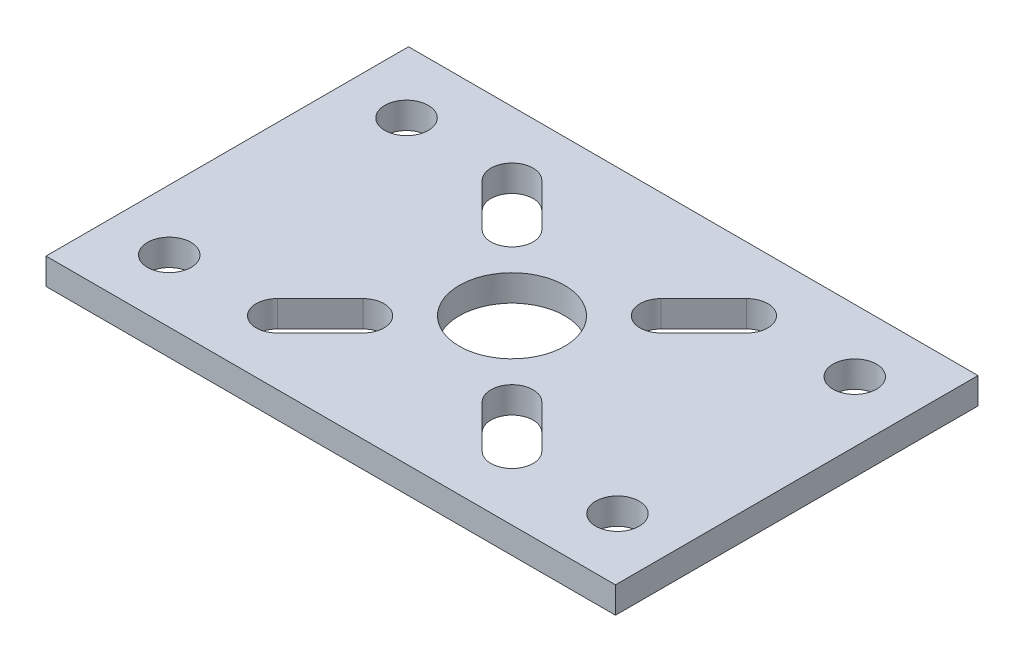
ISO-10303-21;
HEADER;
FILE_DESCRIPTION(('STEP AP214'),'2;1');
FILE_NAME('part.step','',(''),(''),'','','');
FILE_SCHEMA(('AUTOMOTIVE_DESIGN { 1 0 10303 214 1 1 1 1 }'));
ENDSEC;
DATA;
#1=APPLICATION_CONTEXT('core data for automotive mechanical design processes');
#2=APPLICATION_PROTOCOL_DEFINITION('international standard','automotive_design',2000,#1);
#3=PRODUCT_CONTEXT('',#1,'mechanical');
#4=PRODUCT('Part','Part','',(#3));
#5=PRODUCT_RELATED_PRODUCT_CATEGORY('part','',(#4));
#6=PRODUCT_DEFINITION_FORMATION('','',#4);
#7=PRODUCT_DEFINITION_CONTEXT('part definition',#1,'design');
#8=PRODUCT_DEFINITION('design','',#6,#7);
#9=PRODUCT_DEFINITION_SHAPE('','',#8);
#10=(LENGTH_UNIT() NAMED_UNIT(*) SI_UNIT(.MILLI.,.METRE.));
#11=(NAMED_UNIT(*) PLANE_ANGLE_UNIT() SI_UNIT($,.RADIAN.));
#12=(NAMED_UNIT(*) SI_UNIT($,.STERADIAN.) SOLID_ANGLE_UNIT());
#13=UNCERTAINTY_MEASURE_WITH_UNIT(LENGTH_MEASURE(1.E-05),#10,'distance_accuracy_value','');
#14=(GEOMETRIC_REPRESENTATION_CONTEXT(3) GLOBAL_UNCERTAINTY_ASSIGNED_CONTEXT((#13)) GLOBAL_UNIT_ASSIGNED_CONTEXT((#10,
#11,#12)) REPRESENTATION_CONTEXT('',''));
#15=CARTESIAN_POINT('',(0.,0.,0.));
#16=DIRECTION('',(0.,0.,1.));
#17=DIRECTION('',(1.,0.,0.));
#18=AXIS2_PLACEMENT_3D('',#15,#16,#17);
#19=CARTESIAN_POINT('',(0.,2.,0.));
#20=DIRECTION('',(0.,-1.,0.));
#21=DIRECTION('',(0.,0.,-1.));
#22=AXIS2_PLACEMENT_3D('',#19,#20,#21);
#23=PLANE('',#22);
#24=CARTESIAN_POINT('',(0.,2.,0.));
#25=DIRECTION('',(0.,1.,0.));
#26=DIRECTION('',(0.,0.,1.));
#27=AXIS2_PLACEMENT_3D('',#24,#25,#26);
#28=CIRCLE('',#27,4.);
#29=CARTESIAN_POINT('',(0.,2.,4.));
#30=VERTEX_POINT('',#29);
#31=EDGE_CURVE('E487',#30,#30,#28,.T.);
#32=ORIENTED_EDGE('',*,*,#31,.F.);
#33=EDGE_LOOP('',(#32));
#34=FACE_BOUND('',#33,.T.);
#35=CARTESIAN_POINT('',(-5.65685424949235,2.,5.65685424949241));
#36=DIRECTION('',(0.,-1.,0.));
#37=DIRECTION('',(0.,0.,-1.));
#38=AXIS2_PLACEMENT_3D('',#35,#36,#37);
#39=CIRCLE('',#38,1.6);
#40=CARTESIAN_POINT('',(-6.78822509939083,2.,4.52548339959394));
#41=VERTEX_POINT('',#40);
#42=CARTESIAN_POINT('',(-4.52548339959387,2.,6.78822509939088));
#43=VERTEX_POINT('',#42);
#44=EDGE_CURVE('E258',#41,#43,#39,.T.);
#45=ORIENTED_EDGE('',*,*,#44,.T.);
#46=DIRECTION('',(-0.707106781186544,0.,0.707106781186551));
#47=VECTOR('',#46,1.);
#48=CARTESIAN_POINT('',(-4.52548339959387,2.,6.78822509939088));
#49=LINE('',#48,#47);
#50=CARTESIAN_POINT('',(-7.7711035252401,2.,10.0338452250371));
#51=VERTEX_POINT('',#50);
#52=EDGE_CURVE('E267',#43,#51,#49,.T.);
#53=ORIENTED_EDGE('',*,*,#52,.T.);
#54=CARTESIAN_POINT('',(-8.90247437513858,2.,8.90247437513868));
#55=DIRECTION('',(0.,-1.,0.));
#56=DIRECTION('',(0.,0.,-1.));
#57=AXIS2_PLACEMENT_3D('',#54,#55,#56);
#58=CIRCLE('',#57,1.6);
#59=CARTESIAN_POINT('',(-10.0338452250371,2.,7.77110352524021));
#60=VERTEX_POINT('',#59);
#61=EDGE_CURVE('E264',#51,#60,#58,.T.);
#62=ORIENTED_EDGE('',*,*,#61,.T.);
#63=DIRECTION('',(0.707106781186544,0.,-0.707106781186551));
#64=VECTOR('',#63,1.);
#65=CARTESIAN_POINT('',(-6.78822509939083,2.,4.52548339959394));
#66=LINE('',#65,#64);
#67=EDGE_CURVE('E261',#60,#41,#66,.T.);
#68=ORIENTED_EDGE('',*,*,#67,.T.);
#69=EDGE_LOOP('',(#45,#53,#62,#68));
#70=FACE_BOUND('',#69,.T.);
#71=CARTESIAN_POINT('',(-17.,2.,9.));
#72=DIRECTION('',(0.,-1.,0.));
#73=DIRECTION('',(0.,0.,-1.));
#74=AXIS2_PLACEMENT_3D('',#71,#72,#73);
#75=CIRCLE('',#74,1.65);
#76=CARTESIAN_POINT('',(-17.,2.,7.35));
#77=VERTEX_POINT('',#76);
#78=EDGE_CURVE('E282',#77,#77,#75,.T.);
#79=ORIENTED_EDGE('',*,*,#78,.T.);
#80=EDGE_LOOP('',(#79));
#81=FACE_BOUND('',#80,.T.);
#82=DIRECTION('',(-0.707106781186544,0.,-0.707106781186551));
#83=VECTOR('',#82,1.);
#84=CARTESIAN_POINT('',(-4.52548339959387,2.,-6.78822509939088));
#85=LINE('',#84,#83);
#86=CARTESIAN_POINT('',(-4.52548339959387,2.,-6.78822509939088));
#87=VERTEX_POINT('',#86);
#88=CARTESIAN_POINT('',(-7.7711035252401,2.,-10.0338452250371));
#89=VERTEX_POINT('',#88);
#90=EDGE_CURVE('E299',#87,#89,#85,.T.);
#91=ORIENTED_EDGE('',*,*,#90,.F.);
#92=CARTESIAN_POINT('',(-5.65685424949235,2.,-5.65685424949241));
#93=DIRECTION('',(0.,1.,0.));
#94=DIRECTION('',(0.,0.,1.));
#95=AXIS2_PLACEMENT_3D('',#92,#93,#94);
#96=CIRCLE('',#95,1.6);
#97=CARTESIAN_POINT('',(-6.78822509939083,2.,-4.52548339959394));
#98=VERTEX_POINT('',#97);
#99=EDGE_CURVE('E297',#98,#87,#96,.T.);
#100=ORIENTED_EDGE('',*,*,#99,.F.);
#101=DIRECTION('',(0.707106781186544,0.,0.707106781186551));
#102=VECTOR('',#101,1.);
#103=CARTESIAN_POINT('',(-6.78822509939083,2.,-4.52548339959394));
#104=LINE('',#103,#102);
#105=CARTESIAN_POINT('',(-10.0338452250371,2.,-7.77110352524021));
#106=VERTEX_POINT('',#105);
#107=EDGE_CURVE('E305',#106,#98,#104,.T.);
#108=ORIENTED_EDGE('',*,*,#107,.F.);
#109=CARTESIAN_POINT('',(-8.90247437513858,2.,-8.90247437513868));
#110=DIRECTION('',(0.,1.,0.));
#111=DIRECTION('',(0.,0.,1.));
#112=AXIS2_PLACEMENT_3D('',#109,#110,#111);
#113=CIRCLE('',#112,1.6);
#114=EDGE_CURVE('E302',#89,#106,#113,.T.);
#115=ORIENTED_EDGE('',*,*,#114,.F.);
#116=EDGE_LOOP('',(#91,#100,#108,#115));
#117=FACE_BOUND('',#116,.T.);
#118=CARTESIAN_POINT('',(-17.,2.,-9.));
#119=DIRECTION('',(0.,1.,0.));
#120=DIRECTION('',(0.,0.,1.));
#121=AXIS2_PLACEMENT_3D('',#118,#119,#120);
#122=CIRCLE('',#121,1.65);
#123=CARTESIAN_POINT('',(-17.,2.,-7.35));
#124=VERTEX_POINT('',#123);
#125=EDGE_CURVE('E321',#124,#124,#122,.T.);
#126=ORIENTED_EDGE('',*,*,#125,.F.);
#127=EDGE_LOOP('',(#126));
#128=FACE_BOUND('',#127,.T.);
#129=DIRECTION('',(0.,0.,-1.));
#130=VECTOR('',#129,1.);
#131=CARTESIAN_POINT('',(21.6,2.,13.75));
#132=LINE('',#131,#130);
#133=CARTESIAN_POINT('',(21.6,2.,13.75));
#134=VERTEX_POINT('',#133);
#135=CARTESIAN_POINT('',(21.6,2.,-13.75));
#136=VERTEX_POINT('',#135);
#137=EDGE_CURVE('E327',#134,#136,#132,.T.);
#138=ORIENTED_EDGE('',*,*,#137,.T.);
#139=DIRECTION('',(-1.,0.,0.));
#140=VECTOR('',#139,1.);
#141=CARTESIAN_POINT('',(-21.6,2.,-13.75));
#142=LINE('',#141,#140);
#143=CARTESIAN_POINT('',(-21.6,2.,-13.75));
#144=VERTEX_POINT('',#143);
#145=EDGE_CURVE('E330',#136,#144,#142,.T.);
#146=ORIENTED_EDGE('',*,*,#145,.T.);
#147=DIRECTION('',(0.,0.,1.));
#148=VECTOR('',#147,1.);
#149=CARTESIAN_POINT('',(-21.6,2.,13.75));
#150=LINE('',#149,#148);
#151=CARTESIAN_POINT('',(-21.6,2.,13.75));
#152=VERTEX_POINT('',#151);
#153=EDGE_CURVE('E333',#144,#152,#150,.T.);
#154=ORIENTED_EDGE('',*,*,#153,.T.);
#155=DIRECTION('',(1.,0.,0.));
#156=VECTOR('',#155,1.);
#157=CARTESIAN_POINT('',(-21.6,2.,13.75));
#158=LINE('',#157,#156);
#159=EDGE_CURVE('E335',#152,#134,#158,.T.);
#160=ORIENTED_EDGE('',*,*,#159,.T.);
#161=EDGE_LOOP('',(#138,#146,#154,#160));
#162=FACE_BOUND('',#161,.T.);
#163=CARTESIAN_POINT('',(17.,2.,9.));
#164=DIRECTION('',(0.,1.,0.));
#165=DIRECTION('',(0.,0.,-1.));
#166=AXIS2_PLACEMENT_3D('',#163,#164,#165);
#167=CIRCLE('',#166,1.65);
#168=CARTESIAN_POINT('',(17.,2.,7.35));
#169=VERTEX_POINT('',#168);
#170=EDGE_CURVE('E245',#169,#169,#167,.T.);
#171=ORIENTED_EDGE('',*,*,#170,.F.);
#172=EDGE_LOOP('',(#171));
#173=FACE_BOUND('',#172,.T.);
#174=DIRECTION('',(0.707106781186544,0.,0.707106781186551));
#175=VECTOR('',#174,1.);
#176=CARTESIAN_POINT('',(4.52548339959387,2.,6.78822509939088));
#177=LINE('',#176,#175);
#178=CARTESIAN_POINT('',(4.52548339959387,2.,6.78822509939088));
#179=VERTEX_POINT('',#178);
#180=CARTESIAN_POINT('',(7.7711035252401,2.,10.0338452250371));
#181=VERTEX_POINT('',#180);
#182=EDGE_CURVE('E223',#179,#181,#177,.T.);
#183=ORIENTED_EDGE('',*,*,#182,.F.);
#184=CARTESIAN_POINT('',(5.65685424949235,2.,5.65685424949241));
#185=DIRECTION('',(0.,1.,0.));
#186=DIRECTION('',(0.,0.,-1.));
#187=AXIS2_PLACEMENT_3D('',#184,#185,#186);
#188=CIRCLE('',#187,1.6);
#189=CARTESIAN_POINT('',(6.78822509939083,2.,4.52548339959394));
#190=VERTEX_POINT('',#189);
#191=EDGE_CURVE('E221',#190,#179,#188,.T.);
#192=ORIENTED_EDGE('',*,*,#191,.F.);
#193=DIRECTION('',(-0.707106781186544,0.,-0.707106781186551));
#194=VECTOR('',#193,1.);
#195=CARTESIAN_POINT('',(6.78822509939083,2.,4.52548339959394));
#196=LINE('',#195,#194);
#197=CARTESIAN_POINT('',(10.0338452250371,2.,7.77110352524021));
#198=VERTEX_POINT('',#197);
#199=EDGE_CURVE('E229',#198,#190,#196,.T.);
#200=ORIENTED_EDGE('',*,*,#199,.F.);
#201=CARTESIAN_POINT('',(8.90247437513858,2.,8.90247437513868));
#202=DIRECTION('',(0.,1.,0.));
#203=DIRECTION('',(0.,0.,-1.));
#204=AXIS2_PLACEMENT_3D('',#201,#202,#203);
#205=CIRCLE('',#204,1.6);
#206=EDGE_CURVE('E226',#181,#198,#205,.T.);
#207=ORIENTED_EDGE('',*,*,#206,.F.);
#208=EDGE_LOOP('',(#183,#192,#200,#207));
#209=FACE_BOUND('',#208,.T.);
#210=CARTESIAN_POINT('',(17.,2.,-9.));
#211=DIRECTION('',(0.,-1.,0.));
#212=DIRECTION('',(0.,0.,1.));
#213=AXIS2_PLACEMENT_3D('',#210,#211,#212);
#214=CIRCLE('',#213,1.65);
#215=CARTESIAN_POINT('',(17.,2.,-7.35));
#216=VERTEX_POINT('',#215);
#217=EDGE_CURVE('E185',#216,#216,#214,.T.);
#218=ORIENTED_EDGE('',*,*,#217,.T.);
#219=EDGE_LOOP('',(#218));
#220=FACE_BOUND('',#219,.T.);
#221=CARTESIAN_POINT('',(5.65685424949235,2.,-5.65685424949241));
#222=DIRECTION('',(0.,-1.,0.));
#223=DIRECTION('',(0.,0.,1.));
#224=AXIS2_PLACEMENT_3D('',#221,#222,#223);
#225=CIRCLE('',#224,1.6);
#226=CARTESIAN_POINT('',(6.78822509939083,2.,-4.52548339959394));
#227=VERTEX_POINT('',#226);
#228=CARTESIAN_POINT('',(4.52548339959387,2.,-6.78822509939088));
#229=VERTEX_POINT('',#228);
#230=EDGE_CURVE('E49',#227,#229,#225,.T.);
#231=ORIENTED_EDGE('',*,*,#230,.T.);
#232=DIRECTION('',(0.707106781186544,0.,-0.707106781186551));
#233=VECTOR('',#232,1.);
#234=CARTESIAN_POINT('',(4.52548339959387,2.,-6.78822509939088));
#235=LINE('',#234,#233);
#236=CARTESIAN_POINT('',(7.7711035252401,2.,-10.0338452250371));
#237=VERTEX_POINT('',#236);
#238=EDGE_CURVE('E179',#229,#237,#235,.T.);
#239=ORIENTED_EDGE('',*,*,#238,.T.);
#240=CARTESIAN_POINT('',(8.90247437513858,2.,-8.90247437513868));
#241=DIRECTION('',(0.,-1.,0.));
#242=DIRECTION('',(0.,0.,1.));
#243=AXIS2_PLACEMENT_3D('',#240,#241,#242);
#244=CIRCLE('',#243,1.6);
#245=CARTESIAN_POINT('',(10.0338452250371,2.,-7.77110352524021));
#246=VERTEX_POINT('',#245);
#247=EDGE_CURVE('E198',#237,#246,#244,.T.);
#248=ORIENTED_EDGE('',*,*,#247,.T.);
#249=DIRECTION('',(-0.707106781186544,0.,0.707106781186551));
#250=VECTOR('',#249,1.);
#251=CARTESIAN_POINT('',(6.78822509939083,2.,-4.52548339959394));
#252=LINE('',#251,#250);
#253=EDGE_CURVE('E192',#246,#227,#252,.T.);
#254=ORIENTED_EDGE('',*,*,#253,.T.);
#255=EDGE_LOOP('',(#231,#239,#248,#254));
#256=FACE_BOUND('',#255,.T.);
#257=ADVANCED_FACE('F34',(#34,#70,#81,#117,#128,#162,#173,#209,#220,#256),#23,.F.);
#258=CARTESIAN_POINT('',(0.,0.,0.));
#259=DIRECTION('',(0.,-1.,0.));
#260=DIRECTION('',(0.,0.,-1.));
#261=AXIS2_PLACEMENT_3D('',#258,#259,#260);
#262=PLANE('',#261);
#263=CARTESIAN_POINT('',(0.,0.,0.));
#264=DIRECTION('',(0.,-1.,0.));
#265=DIRECTION('',(0.,0.,-1.));
#266=AXIS2_PLACEMENT_3D('',#263,#264,#265);
#267=CIRCLE('',#266,4.);
#268=CARTESIAN_POINT('',(0.,0.,-4.));
#269=VERTEX_POINT('',#268);
#270=EDGE_CURVE('E485',#269,#269,#267,.F.);
#271=ORIENTED_EDGE('',*,*,#270,.T.);
#272=EDGE_LOOP('',(#271));
#273=FACE_BOUND('',#272,.T.);
#274=CARTESIAN_POINT('',(17.,0.,-9.));
#275=DIRECTION('',(0.,-1.,0.));
#276=DIRECTION('',(0.,0.,-1.));
#277=AXIS2_PLACEMENT_3D('',#274,#275,#276);
#278=CIRCLE('',#277,1.65);
#279=CARTESIAN_POINT('',(17.,0.,-10.65));
#280=VERTEX_POINT('',#279);
#281=EDGE_CURVE('E209',#280,#280,#278,.T.);
#282=ORIENTED_EDGE('',*,*,#281,.F.);
#283=EDGE_LOOP('',(#282));
#284=FACE_BOUND('',#283,.T.);
#285=CARTESIAN_POINT('',(5.65685424949235,0.,5.65685424949241));
#286=DIRECTION('',(0.,-1.,0.));
#287=DIRECTION('',(0.,0.,-1.));
#288=AXIS2_PLACEMENT_3D('',#285,#286,#287);
#289=CIRCLE('',#288,1.6);
#290=CARTESIAN_POINT('',(6.78822509939083,0.,4.52548339959394));
#291=VERTEX_POINT('',#290);
#292=CARTESIAN_POINT('',(4.52548339959387,0.,6.78822509939088));
#293=VERTEX_POINT('',#292);
#294=EDGE_CURVE('E218',#291,#293,#289,.F.);
#295=ORIENTED_EDGE('',*,*,#294,.T.);
#296=DIRECTION('',(0.707106781186544,0.,0.707106781186551));
#297=VECTOR('',#296,1.);
#298=CARTESIAN_POINT('',(4.52548339959387,0.,6.78822509939088));
#299=LINE('',#298,#297);
#300=CARTESIAN_POINT('',(7.7711035252401,0.,10.0338452250371));
#301=VERTEX_POINT('',#300);
#302=EDGE_CURVE('E235',#293,#301,#299,.T.);
#303=ORIENTED_EDGE('',*,*,#302,.T.);
#304=CARTESIAN_POINT('',(8.90247437513858,0.,8.90247437513868));
#305=DIRECTION('',(0.,-1.,0.));
#306=DIRECTION('',(0.,0.,-1.));
#307=AXIS2_PLACEMENT_3D('',#304,#305,#306);
#308=CIRCLE('',#307,1.6);
#309=CARTESIAN_POINT('',(10.0338452250371,0.,7.77110352524021));
#310=VERTEX_POINT('',#309);
#311=EDGE_CURVE('E212',#301,#310,#308,.F.);
#312=ORIENTED_EDGE('',*,*,#311,.T.);
#313=DIRECTION('',(-0.707106781186544,0.,-0.707106781186551));
#314=VECTOR('',#313,1.);
#315=CARTESIAN_POINT('',(6.78822509939083,0.,4.52548339959394));
#316=LINE('',#315,#314);
#317=EDGE_CURVE('E215',#310,#291,#316,.T.);
#318=ORIENTED_EDGE('',*,*,#317,.T.);
#319=EDGE_LOOP('',(#295,#303,#312,#318));
#320=FACE_BOUND('',#319,.T.);
#321=CARTESIAN_POINT('',(17.,0.,9.));
#322=DIRECTION('',(0.,-1.,0.));
#323=DIRECTION('',(0.,0.,-1.));
#324=AXIS2_PLACEMENT_3D('',#321,#322,#323);
#325=CIRCLE('',#324,1.65);
#326=CARTESIAN_POINT('',(17.,0.,7.35));
#327=VERTEX_POINT('',#326);
#328=EDGE_CURVE('E244',#327,#327,#325,.F.);
#329=ORIENTED_EDGE('',*,*,#328,.T.);
#330=EDGE_LOOP('',(#329));
#331=FACE_BOUND('',#330,.T.);
#332=CARTESIAN_POINT('',(-17.,0.,9.));
#333=DIRECTION('',(0.,-1.,0.));
#334=DIRECTION('',(0.,0.,-1.));
#335=AXIS2_PLACEMENT_3D('',#332,#333,#334);
#336=CIRCLE('',#335,1.65);
#337=CARTESIAN_POINT('',(-17.,0.,7.35));
#338=VERTEX_POINT('',#337);
#339=EDGE_CURVE('E285',#338,#338,#336,.T.);
#340=ORIENTED_EDGE('',*,*,#339,.F.);
#341=EDGE_LOOP('',(#340));
#342=FACE_BOUND('',#341,.T.);
#343=CARTESIAN_POINT('',(-5.65685424949235,0.,-5.65685424949241));
#344=DIRECTION('',(0.,-1.,0.));
#345=DIRECTION('',(0.,0.,-1.));
#346=AXIS2_PLACEMENT_3D('',#343,#344,#345);
#347=CIRCLE('',#346,1.6);
#348=CARTESIAN_POINT('',(-6.78822509939083,0.,-4.52548339959394));
#349=VERTEX_POINT('',#348);
#350=CARTESIAN_POINT('',(-4.52548339959387,0.,-6.78822509939088));
#351=VERTEX_POINT('',#350);
#352=EDGE_CURVE('E294',#349,#351,#347,.F.);
#353=ORIENTED_EDGE('',*,*,#352,.T.);
#354=DIRECTION('',(-0.707106781186544,0.,-0.707106781186551));
#355=VECTOR('',#354,1.);
#356=CARTESIAN_POINT('',(-4.52548339959387,0.,-6.78822509939088));
#357=LINE('',#356,#355);
#358=CARTESIAN_POINT('',(-7.7711035252401,0.,-10.0338452250371));
#359=VERTEX_POINT('',#358);
#360=EDGE_CURVE('E311',#351,#359,#357,.T.);
#361=ORIENTED_EDGE('',*,*,#360,.T.);
#362=CARTESIAN_POINT('',(-8.90247437513858,0.,-8.90247437513868));
#363=DIRECTION('',(0.,-1.,0.));
#364=DIRECTION('',(0.,0.,-1.));
#365=AXIS2_PLACEMENT_3D('',#362,#363,#364);
#366=CIRCLE('',#365,1.6);
#367=CARTESIAN_POINT('',(-10.0338452250371,0.,-7.77110352524021));
#368=VERTEX_POINT('',#367);
#369=EDGE_CURVE('E288',#359,#368,#366,.F.);
#370=ORIENTED_EDGE('',*,*,#369,.T.);
#371=DIRECTION('',(0.707106781186544,0.,0.707106781186551));
#372=VECTOR('',#371,1.);
#373=CARTESIAN_POINT('',(-6.78822509939083,0.,-4.52548339959394));
#374=LINE('',#373,#372);
#375=EDGE_CURVE('E291',#368,#349,#374,.T.);
#376=ORIENTED_EDGE('',*,*,#375,.T.);
#377=EDGE_LOOP('',(#353,#361,#370,#376));
#378=FACE_BOUND('',#377,.T.);
#379=CARTESIAN_POINT('',(-17.,0.,-9.));
#380=DIRECTION('',(0.,-1.,0.));
#381=DIRECTION('',(0.,0.,-1.));
#382=AXIS2_PLACEMENT_3D('',#379,#380,#381);
#383=CIRCLE('',#382,1.65);
#384=CARTESIAN_POINT('',(-17.,0.,-10.65));
#385=VERTEX_POINT('',#384);
#386=EDGE_CURVE('E320',#385,#385,#383,.F.);
#387=ORIENTED_EDGE('',*,*,#386,.T.);
#388=EDGE_LOOP('',(#387));
#389=FACE_BOUND('',#388,.T.);
#390=DIRECTION('',(0.,0.,-1.));
#391=VECTOR('',#390,1.);
#392=CARTESIAN_POINT('',(21.6,0.,13.75));
#393=LINE('',#392,#391);
#394=CARTESIAN_POINT('',(21.6,0.,13.75));
#395=VERTEX_POINT('',#394);
#396=CARTESIAN_POINT('',(21.6,0.,-13.75));
#397=VERTEX_POINT('',#396);
#398=EDGE_CURVE('E324',#395,#397,#393,.T.);
#399=ORIENTED_EDGE('',*,*,#398,.F.);
#400=DIRECTION('',(1.,0.,0.));
#401=VECTOR('',#400,1.);
#402=CARTESIAN_POINT('',(-21.6,0.,13.75));
#403=LINE('',#402,#401);
#404=CARTESIAN_POINT('',(-21.6,0.,13.75));
#405=VERTEX_POINT('',#404);
#406=EDGE_CURVE('E331',#405,#395,#403,.T.);
#407=ORIENTED_EDGE('',*,*,#406,.F.);
#408=DIRECTION('',(0.,0.,1.));
#409=VECTOR('',#408,1.);
#410=CARTESIAN_POINT('',(-21.6,0.,13.75));
#411=LINE('',#410,#409);
#412=CARTESIAN_POINT('',(-21.6,0.,-13.75));
#413=VERTEX_POINT('',#412);
#414=EDGE_CURVE('E342',#413,#405,#411,.T.);
#415=ORIENTED_EDGE('',*,*,#414,.F.);
#416=DIRECTION('',(-1.,0.,0.));
#417=VECTOR('',#416,1.);
#418=CARTESIAN_POINT('',(-21.6,0.,-13.75));
#419=LINE('',#418,#417);
#420=EDGE_CURVE('E340',#397,#413,#419,.T.);
#421=ORIENTED_EDGE('',*,*,#420,.F.);
#422=EDGE_LOOP('',(#399,#407,#415,#421));
#423=FACE_BOUND('',#422,.T.);
#424=DIRECTION('',(-0.707106781186544,0.,0.707106781186551));
#425=VECTOR('',#424,1.);
#426=CARTESIAN_POINT('',(-4.52548339959387,0.,6.78822509939088));
#427=LINE('',#426,#425);
#428=CARTESIAN_POINT('',(-4.52548339959387,0.,6.78822509939088));
#429=VERTEX_POINT('',#428);
#430=CARTESIAN_POINT('',(-7.7711035252401,0.,10.0338452250371));
#431=VERTEX_POINT('',#430);
#432=EDGE_CURVE('E252',#429,#431,#427,.T.);
#433=ORIENTED_EDGE('',*,*,#432,.F.);
#434=CARTESIAN_POINT('',(-5.65685424949235,0.,5.65685424949241));
#435=DIRECTION('',(0.,-1.,0.));
#436=DIRECTION('',(0.,0.,-1.));
#437=AXIS2_PLACEMENT_3D('',#434,#435,#436);
#438=CIRCLE('',#437,1.6);
#439=CARTESIAN_POINT('',(-6.78822509939083,0.,4.52548339959394));
#440=VERTEX_POINT('',#439);
#441=EDGE_CURVE('E255',#440,#429,#438,.T.);
#442=ORIENTED_EDGE('',*,*,#441,.F.);
#443=DIRECTION('',(0.707106781186544,0.,-0.707106781186551));
#444=VECTOR('',#443,1.);
#445=CARTESIAN_POINT('',(-6.78822509939083,0.,4.52548339959394));
#446=LINE('',#445,#444);
#447=CARTESIAN_POINT('',(-10.0338452250371,0.,7.77110352524021));
#448=VERTEX_POINT('',#447);
#449=EDGE_CURVE('E273',#448,#440,#446,.T.);
#450=ORIENTED_EDGE('',*,*,#449,.F.);
#451=CARTESIAN_POINT('',(-8.90247437513858,0.,8.90247437513868));
#452=DIRECTION('',(0.,-1.,0.));
#453=DIRECTION('',(0.,0.,-1.));
#454=AXIS2_PLACEMENT_3D('',#451,#452,#453);
#455=CIRCLE('',#454,1.6);
#456=EDGE_CURVE('E248',#431,#448,#455,.T.);
#457=ORIENTED_EDGE('',*,*,#456,.F.);
#458=EDGE_LOOP('',(#433,#442,#450,#457));
#459=FACE_BOUND('',#458,.T.);
#460=DIRECTION('',(0.707106781186544,0.,-0.707106781186551));
#461=VECTOR('',#460,1.);
#462=CARTESIAN_POINT('',(4.52548339959387,0.,-6.78822509939088));
#463=LINE('',#462,#461);
#464=CARTESIAN_POINT('',(4.52548339959387,0.,-6.78822509939088));
#465=VERTEX_POINT('',#464);
#466=CARTESIAN_POINT('',(7.7711035252401,0.,-10.0338452250371));
#467=VERTEX_POINT('',#466);
#468=EDGE_CURVE('E190',#465,#467,#463,.T.);
#469=ORIENTED_EDGE('',*,*,#468,.F.);
#470=CARTESIAN_POINT('',(5.65685424949235,0.,-5.65685424949241));
#471=DIRECTION('',(0.,-1.,0.));
#472=DIRECTION('',(0.,0.,-1.));
#473=AXIS2_PLACEMENT_3D('',#470,#471,#472);
#474=CIRCLE('',#473,1.6);
#475=CARTESIAN_POINT('',(6.78822509939083,0.,-4.52548339959394));
#476=VERTEX_POINT('',#475);
#477=EDGE_CURVE('E173',#476,#465,#474,.T.);
#478=ORIENTED_EDGE('',*,*,#477,.F.);
#479=DIRECTION('',(-0.707106781186544,0.,0.707106781186551));
#480=VECTOR('',#479,1.);
#481=CARTESIAN_POINT('',(6.78822509939083,0.,-4.52548339959394));
#482=LINE('',#481,#480);
#483=CARTESIAN_POINT('',(10.0338452250371,0.,-7.77110352524021));
#484=VERTEX_POINT('',#483);
#485=EDGE_CURVE('E182',#484,#476,#482,.T.);
#486=ORIENTED_EDGE('',*,*,#485,.F.);
#487=CARTESIAN_POINT('',(8.90247437513858,0.,-8.90247437513868));
#488=DIRECTION('',(0.,-1.,0.));
#489=DIRECTION('',(0.,0.,-1.));
#490=AXIS2_PLACEMENT_3D('',#487,#488,#489);
#491=CIRCLE('',#490,1.6);
#492=EDGE_CURVE('E57',#467,#484,#491,.T.);
#493=ORIENTED_EDGE('',*,*,#492,.F.);
#494=EDGE_LOOP('',(#469,#478,#486,#493));
#495=FACE_BOUND('',#494,.T.);
#496=ADVANCED_FACE('F188',(#273,#284,#320,#331,#342,#378,#389,#423,#459,#495),#262,.T.);
#497=CARTESIAN_POINT('',(21.6,2.,13.75));
#498=DIRECTION('',(-1.,0.,0.));
#499=DIRECTION('',(0.,0.,1.));
#500=AXIS2_PLACEMENT_3D('',#497,#498,#499);
#501=PLANE('',#500);
#502=ORIENTED_EDGE('',*,*,#398,.T.);
#503=DIRECTION('',(0.,-1.,0.));
#504=VECTOR('',#503,1.);
#505=CARTESIAN_POINT('',(21.6,2.,-13.75));
#506=LINE('',#505,#504);
#507=EDGE_CURVE('E11',#136,#397,#506,.T.);
#508=ORIENTED_EDGE('',*,*,#507,.F.);
#509=ORIENTED_EDGE('',*,*,#137,.F.);
#510=DIRECTION('',(0.,-1.,0.));
#511=VECTOR('',#510,1.);
#512=CARTESIAN_POINT('',(21.6,2.,13.75));
#513=LINE('',#512,#511);
#514=EDGE_CURVE('E337',#134,#395,#513,.T.);
#515=ORIENTED_EDGE('',*,*,#514,.T.);
#516=EDGE_LOOP('',(#502,#508,#509,#515));
#517=FACE_BOUND('',#516,.T.);
#518=ADVANCED_FACE('F36',(#517),#501,.F.);
#519=CARTESIAN_POINT('',(-21.6,2.,-13.75));
#520=DIRECTION('',(0.,0.,1.));
#521=DIRECTION('',(1.,0.,0.));
#522=AXIS2_PLACEMENT_3D('',#519,#520,#521);
#523=PLANE('',#522);
#524=ORIENTED_EDGE('',*,*,#420,.T.);
#525=DIRECTION('',(0.,-1.,0.));
#526=VECTOR('',#525,1.);
#527=CARTESIAN_POINT('',(-21.6,2.,-13.75));
#528=LINE('',#527,#526);
#529=EDGE_CURVE('E42',#144,#413,#528,.T.);
#530=ORIENTED_EDGE('',*,*,#529,.F.);
#531=ORIENTED_EDGE('',*,*,#145,.F.);
#532=ORIENTED_EDGE('',*,*,#507,.T.);
#533=EDGE_LOOP('',(#524,#530,#531,#532));
#534=FACE_BOUND('',#533,.T.);
#535=ADVANCED_FACE('F370',(#534),#523,.F.);
#536=CARTESIAN_POINT('',(-21.6,2.,13.75));
#537=DIRECTION('',(1.,0.,0.));
#538=DIRECTION('',(0.,0.,-1.));
#539=AXIS2_PLACEMENT_3D('',#536,#537,#538);
#540=PLANE('',#539);
#541=ORIENTED_EDGE('',*,*,#414,.T.);
#542=DIRECTION('',(0.,-1.,0.));
#543=VECTOR('',#542,1.);
#544=CARTESIAN_POINT('',(-21.6,2.,13.75));
#545=LINE('',#544,#543);
#546=EDGE_CURVE('E347',#152,#405,#545,.T.);
#547=ORIENTED_EDGE('',*,*,#546,.F.);
#548=ORIENTED_EDGE('',*,*,#153,.F.);
#549=ORIENTED_EDGE('',*,*,#529,.T.);
#550=EDGE_LOOP('',(#541,#547,#548,#549));
#551=FACE_BOUND('',#550,.T.);
#552=ADVANCED_FACE('F354',(#551),#540,.F.);
#553=CARTESIAN_POINT('',(-21.6,2.,13.75));
#554=DIRECTION('',(0.,0.,-1.));
#555=DIRECTION('',(-1.,0.,0.));
#556=AXIS2_PLACEMENT_3D('',#553,#554,#555);
#557=PLANE('',#556);
#558=ORIENTED_EDGE('',*,*,#406,.T.);
#559=ORIENTED_EDGE('',*,*,#514,.F.);
#560=ORIENTED_EDGE('',*,*,#159,.F.);
#561=ORIENTED_EDGE('',*,*,#546,.T.);
#562=EDGE_LOOP('',(#558,#559,#560,#561));
#563=FACE_BOUND('',#562,.T.);
#564=ADVANCED_FACE('F363',(#563),#557,.F.);
#565=CARTESIAN_POINT('',(-17.,-0.00100000000000013,-9.));
#566=DIRECTION('',(0.,1.,0.));
#567=DIRECTION('',(0.,0.,1.));
#568=AXIS2_PLACEMENT_3D('',#565,#566,#567);
#569=CYLINDRICAL_SURFACE('',#568,1.65);
#570=ORIENTED_EDGE('',*,*,#386,.F.);
#571=EDGE_LOOP('',(#570));
#572=FACE_BOUND('',#571,.T.);
#573=ORIENTED_EDGE('',*,*,#125,.T.);
#574=EDGE_LOOP('',(#573));
#575=FACE_BOUND('',#574,.T.);
#576=ADVANCED_FACE('F389',(#572,#575),#569,.F.);
#577=CARTESIAN_POINT('',(-5.65685424949235,-0.00100000000000013,-5.65685424949241));
#578=DIRECTION('',(0.,1.,0.));
#579=DIRECTION('',(0.,0.,1.));
#580=AXIS2_PLACEMENT_3D('',#577,#578,#579);
#581=CYLINDRICAL_SURFACE('',#580,1.6);
#582=DIRECTION('',(0.,1.,0.));
#583=VECTOR('',#582,1.);
#584=CARTESIAN_POINT('',(-6.78822509939083,-0.00100000000000013,-4.52548339959394));
#585=LINE('',#584,#583);
#586=EDGE_CURVE('E309',#349,#98,#585,.T.);
#587=ORIENTED_EDGE('',*,*,#586,.T.);
#588=ORIENTED_EDGE('',*,*,#99,.T.);
#589=DIRECTION('',(0.,1.,0.));
#590=VECTOR('',#589,1.);
#591=CARTESIAN_POINT('',(-4.52548339959387,-0.00100000000000013,-6.78822509939088));
#592=LINE('',#591,#590);
#593=EDGE_CURVE('E308',#351,#87,#592,.T.);
#594=ORIENTED_EDGE('',*,*,#593,.F.);
#595=ORIENTED_EDGE('',*,*,#352,.F.);
#596=EDGE_LOOP('',(#587,#588,#594,#595));
#597=FACE_BOUND('',#596,.T.);
#598=ADVANCED_FACE('F396',(#597),#581,.F.);
#599=CARTESIAN_POINT('',(-6.78822509939083,-0.00100000000000013,-4.52548339959394));
#600=DIRECTION('',(-0.707106781186551,0.,0.707106781186544));
#601=DIRECTION('',(0.707106781186544,0.,0.707106781186551));
#602=AXIS2_PLACEMENT_3D('',#599,#600,#601);
#603=PLANE('',#602);
#604=DIRECTION('',(0.,1.,0.));
#605=VECTOR('',#604,1.);
#606=CARTESIAN_POINT('',(-10.0338452250371,-0.00100000000000013,-7.77110352524021));
#607=LINE('',#606,#605);
#608=EDGE_CURVE('E312',#368,#106,#607,.T.);
#609=ORIENTED_EDGE('',*,*,#608,.T.);
#610=ORIENTED_EDGE('',*,*,#107,.T.);
#611=ORIENTED_EDGE('',*,*,#586,.F.);
#612=ORIENTED_EDGE('',*,*,#375,.F.);
#613=EDGE_LOOP('',(#609,#610,#611,#612));
#614=FACE_BOUND('',#613,.T.);
#615=ADVANCED_FACE('F401',(#614),#603,.F.);
#616=CARTESIAN_POINT('',(-8.90247437513858,-0.00100000000000013,-8.90247437513868));
#617=DIRECTION('',(0.,1.,0.));
#618=DIRECTION('',(0.,0.,1.));
#619=AXIS2_PLACEMENT_3D('',#616,#617,#618);
#620=CYLINDRICAL_SURFACE('',#619,1.6);
#621=DIRECTION('',(0.,1.,0.));
#622=VECTOR('',#621,1.);
#623=CARTESIAN_POINT('',(-7.7711035252401,-0.00100000000000013,-10.0338452250371));
#624=LINE('',#623,#622);
#625=EDGE_CURVE('E314',#359,#89,#624,.T.);
#626=ORIENTED_EDGE('',*,*,#625,.T.);
#627=ORIENTED_EDGE('',*,*,#114,.T.);
#628=ORIENTED_EDGE('',*,*,#608,.F.);
#629=ORIENTED_EDGE('',*,*,#369,.F.);
#630=EDGE_LOOP('',(#626,#627,#628,#629));
#631=FACE_BOUND('',#630,.T.);
#632=ADVANCED_FACE('F411',(#631),#620,.F.);
#633=CARTESIAN_POINT('',(-4.52548339959387,-0.00100000000000013,-6.78822509939088));
#634=DIRECTION('',(0.707106781186551,0.,-0.707106781186544));
#635=DIRECTION('',(-0.707106781186544,0.,-0.707106781186551));
#636=AXIS2_PLACEMENT_3D('',#633,#634,#635);
#637=PLANE('',#636);
#638=ORIENTED_EDGE('',*,*,#593,.T.);
#639=ORIENTED_EDGE('',*,*,#90,.T.);
#640=ORIENTED_EDGE('',*,*,#625,.F.);
#641=ORIENTED_EDGE('',*,*,#360,.F.);
#642=EDGE_LOOP('',(#638,#639,#640,#641));
#643=FACE_BOUND('',#642,.T.);
#644=ADVANCED_FACE('F415',(#643),#637,.F.);
#645=CARTESIAN_POINT('',(-17.,-0.00100000000000013,9.));
#646=DIRECTION('',(0.,1.,0.));
#647=DIRECTION('',(0.,0.,1.));
#648=AXIS2_PLACEMENT_3D('',#645,#646,#647);
#649=CYLINDRICAL_SURFACE('',#648,1.65);
#650=ORIENTED_EDGE('',*,*,#339,.T.);
#651=EDGE_LOOP('',(#650));
#652=FACE_BOUND('',#651,.T.);
#653=ORIENTED_EDGE('',*,*,#78,.F.);
#654=EDGE_LOOP('',(#653));
#655=FACE_BOUND('',#654,.T.);
#656=ADVANCED_FACE('F418',(#652,#655),#649,.F.);
#657=CARTESIAN_POINT('',(-5.65685424949235,-0.00100000000000013,5.65685424949241));
#658=DIRECTION('',(0.,1.,0.));
#659=DIRECTION('',(0.,0.,1.));
#660=AXIS2_PLACEMENT_3D('',#657,#658,#659);
#661=CYLINDRICAL_SURFACE('',#660,1.6);
#662=ORIENTED_EDGE('',*,*,#441,.T.);
#663=DIRECTION('',(0.,1.,0.));
#664=VECTOR('',#663,1.);
#665=CARTESIAN_POINT('',(-4.52548339959387,-0.00100000000000013,6.78822509939088));
#666=LINE('',#665,#664);
#667=EDGE_CURVE('E271',#429,#43,#666,.T.);
#668=ORIENTED_EDGE('',*,*,#667,.T.);
#669=ORIENTED_EDGE('',*,*,#44,.F.);
#670=DIRECTION('',(0.,1.,0.));
#671=VECTOR('',#670,1.);
#672=CARTESIAN_POINT('',(-6.78822509939083,-0.00100000000000013,4.52548339959394));
#673=LINE('',#672,#671);
#674=EDGE_CURVE('E270',#440,#41,#673,.T.);
#675=ORIENTED_EDGE('',*,*,#674,.F.);
#676=EDGE_LOOP('',(#662,#668,#669,#675));
#677=FACE_BOUND('',#676,.T.);
#678=ADVANCED_FACE('F425',(#677),#661,.F.);
#679=CARTESIAN_POINT('',(-4.52548339959387,-0.00100000000000013,6.78822509939088));
#680=DIRECTION('',(-0.707106781186551,0.,-0.707106781186544));
#681=DIRECTION('',(-0.707106781186544,0.,0.707106781186551));
#682=AXIS2_PLACEMENT_3D('',#679,#680,#681);
#683=PLANE('',#682);
#684=ORIENTED_EDGE('',*,*,#432,.T.);
#685=DIRECTION('',(0.,1.,0.));
#686=VECTOR('',#685,1.);
#687=CARTESIAN_POINT('',(-7.7711035252401,-0.00100000000000013,10.0338452250371));
#688=LINE('',#687,#686);
#689=EDGE_CURVE('E274',#431,#51,#688,.T.);
#690=ORIENTED_EDGE('',*,*,#689,.T.);
#691=ORIENTED_EDGE('',*,*,#52,.F.);
#692=ORIENTED_EDGE('',*,*,#667,.F.);
#693=EDGE_LOOP('',(#684,#690,#691,#692));
#694=FACE_BOUND('',#693,.T.);
#695=ADVANCED_FACE('F429',(#694),#683,.T.);
#696=CARTESIAN_POINT('',(-8.90247437513858,-0.00100000000000013,8.90247437513868));
#697=DIRECTION('',(0.,1.,0.));
#698=DIRECTION('',(0.,0.,1.));
#699=AXIS2_PLACEMENT_3D('',#696,#697,#698);
#700=CYLINDRICAL_SURFACE('',#699,1.6);
#701=ORIENTED_EDGE('',*,*,#456,.T.);
#702=DIRECTION('',(0.,1.,0.));
#703=VECTOR('',#702,1.);
#704=CARTESIAN_POINT('',(-10.0338452250371,-0.00100000000000013,7.77110352524021));
#705=LINE('',#704,#703);
#706=EDGE_CURVE('E276',#448,#60,#705,.T.);
#707=ORIENTED_EDGE('',*,*,#706,.T.);
#708=ORIENTED_EDGE('',*,*,#61,.F.);
#709=ORIENTED_EDGE('',*,*,#689,.F.);
#710=EDGE_LOOP('',(#701,#707,#708,#709));
#711=FACE_BOUND('',#710,.T.);
#712=ADVANCED_FACE('F435',(#711),#700,.F.);
#713=CARTESIAN_POINT('',(-6.78822509939083,-0.00100000000000013,4.52548339959394));
#714=DIRECTION('',(0.707106781186551,0.,0.707106781186544));
#715=DIRECTION('',(0.707106781186544,0.,-0.707106781186551));
#716=AXIS2_PLACEMENT_3D('',#713,#714,#715);
#717=PLANE('',#716);
#718=ORIENTED_EDGE('',*,*,#449,.T.);
#719=ORIENTED_EDGE('',*,*,#674,.T.);
#720=ORIENTED_EDGE('',*,*,#67,.F.);
#721=ORIENTED_EDGE('',*,*,#706,.F.);
#722=EDGE_LOOP('',(#718,#719,#720,#721));
#723=FACE_BOUND('',#722,.T.);
#724=ADVANCED_FACE('F431',(#723),#717,.T.);
#725=CARTESIAN_POINT('',(17.,-0.00100000000000013,9.));
#726=DIRECTION('',(0.,1.,0.));
#727=DIRECTION('',(0.,0.,1.));
#728=AXIS2_PLACEMENT_3D('',#725,#726,#727);
#729=CYLINDRICAL_SURFACE('',#728,1.65);
#730=ORIENTED_EDGE('',*,*,#328,.F.);
#731=EDGE_LOOP('',(#730));
#732=FACE_BOUND('',#731,.T.);
#733=ORIENTED_EDGE('',*,*,#170,.T.);
#734=EDGE_LOOP('',(#733));
#735=FACE_BOUND('',#734,.T.);
#736=ADVANCED_FACE('F434',(#732,#735),#729,.F.);
#737=CARTESIAN_POINT('',(5.65685424949235,-0.00100000000000013,5.65685424949241));
#738=DIRECTION('',(0.,1.,0.));
#739=DIRECTION('',(0.,0.,1.));
#740=AXIS2_PLACEMENT_3D('',#737,#738,#739);
#741=CYLINDRICAL_SURFACE('',#740,1.6);
#742=DIRECTION('',(0.,1.,0.));
#743=VECTOR('',#742,1.);
#744=CARTESIAN_POINT('',(6.78822509939083,-0.00100000000000013,4.52548339959394));
#745=LINE('',#744,#743);
#746=EDGE_CURVE('E233',#291,#190,#745,.T.);
#747=ORIENTED_EDGE('',*,*,#746,.T.);
#748=ORIENTED_EDGE('',*,*,#191,.T.);
#749=DIRECTION('',(0.,1.,0.));
#750=VECTOR('',#749,1.);
#751=CARTESIAN_POINT('',(4.52548339959387,-0.00100000000000013,6.78822509939088));
#752=LINE('',#751,#750);
#753=EDGE_CURVE('E232',#293,#179,#752,.T.);
#754=ORIENTED_EDGE('',*,*,#753,.F.);
#755=ORIENTED_EDGE('',*,*,#294,.F.);
#756=EDGE_LOOP('',(#747,#748,#754,#755));
#757=FACE_BOUND('',#756,.T.);
#758=ADVANCED_FACE('F445',(#757),#741,.F.);
#759=CARTESIAN_POINT('',(6.78822509939083,-0.00100000000000013,4.52548339959394));
#760=DIRECTION('',(0.707106781186551,0.,-0.707106781186544));
#761=DIRECTION('',(-0.707106781186544,0.,-0.707106781186551));
#762=AXIS2_PLACEMENT_3D('',#759,#760,#761);
#763=PLANE('',#762);
#764=DIRECTION('',(0.,1.,0.));
#765=VECTOR('',#764,1.);
#766=CARTESIAN_POINT('',(10.0338452250371,-0.00100000000000013,7.77110352524021));
#767=LINE('',#766,#765);
#768=EDGE_CURVE('E236',#310,#198,#767,.T.);
#769=ORIENTED_EDGE('',*,*,#768,.T.);
#770=ORIENTED_EDGE('',*,*,#199,.T.);
#771=ORIENTED_EDGE('',*,*,#746,.F.);
#772=ORIENTED_EDGE('',*,*,#317,.F.);
#773=EDGE_LOOP('',(#769,#770,#771,#772));
#774=FACE_BOUND('',#773,.T.);
#775=ADVANCED_FACE('F449',(#774),#763,.F.);
#776=CARTESIAN_POINT('',(8.90247437513858,-0.00100000000000013,8.90247437513868));
#777=DIRECTION('',(0.,1.,0.));
#778=DIRECTION('',(0.,0.,1.));
#779=AXIS2_PLACEMENT_3D('',#776,#777,#778);
#780=CYLINDRICAL_SURFACE('',#779,1.6);
#781=DIRECTION('',(0.,1.,0.));
#782=VECTOR('',#781,1.);
#783=CARTESIAN_POINT('',(7.7711035252401,-0.00100000000000013,10.0338452250371));
#784=LINE('',#783,#782);
#785=EDGE_CURVE('E238',#301,#181,#784,.T.);
#786=ORIENTED_EDGE('',*,*,#785,.T.);
#787=ORIENTED_EDGE('',*,*,#206,.T.);
#788=ORIENTED_EDGE('',*,*,#768,.F.);
#789=ORIENTED_EDGE('',*,*,#311,.F.);
#790=EDGE_LOOP('',(#786,#787,#788,#789));
#791=FACE_BOUND('',#790,.T.);
#792=ADVANCED_FACE('F455',(#791),#780,.F.);
#793=CARTESIAN_POINT('',(4.52548339959387,-0.00100000000000013,6.78822509939088));
#794=DIRECTION('',(-0.707106781186551,0.,0.707106781186544));
#795=DIRECTION('',(0.707106781186544,0.,0.707106781186551));
#796=AXIS2_PLACEMENT_3D('',#793,#794,#795);
#797=PLANE('',#796);
#798=ORIENTED_EDGE('',*,*,#753,.T.);
#799=ORIENTED_EDGE('',*,*,#182,.T.);
#800=ORIENTED_EDGE('',*,*,#785,.F.);
#801=ORIENTED_EDGE('',*,*,#302,.F.);
#802=EDGE_LOOP('',(#798,#799,#800,#801));
#803=FACE_BOUND('',#802,.T.);
#804=ADVANCED_FACE('F451',(#803),#797,.F.);
#805=CARTESIAN_POINT('',(17.,-0.00100000000000013,-9.));
#806=DIRECTION('',(0.,1.,0.));
#807=DIRECTION('',(0.,0.,1.));
#808=AXIS2_PLACEMENT_3D('',#805,#806,#807);
#809=CYLINDRICAL_SURFACE('',#808,1.65);
#810=ORIENTED_EDGE('',*,*,#281,.T.);
#811=EDGE_LOOP('',(#810));
#812=FACE_BOUND('',#811,.T.);
#813=ORIENTED_EDGE('',*,*,#217,.F.);
#814=EDGE_LOOP('',(#813));
#815=FACE_BOUND('',#814,.T.);
#816=ADVANCED_FACE('F454',(#812,#815),#809,.F.);
#817=CARTESIAN_POINT('',(5.65685424949235,-0.00100000000000013,-5.65685424949241));
#818=DIRECTION('',(0.,1.,0.));
#819=DIRECTION('',(0.,0.,1.));
#820=AXIS2_PLACEMENT_3D('',#817,#818,#819);
#821=CYLINDRICAL_SURFACE('',#820,1.6);
#822=ORIENTED_EDGE('',*,*,#477,.T.);
#823=DIRECTION('',(0.,1.,0.));
#824=VECTOR('',#823,1.);
#825=CARTESIAN_POINT('',(4.52548339959387,-0.00100000000000013,-6.78822509939088));
#826=LINE('',#825,#824);
#827=EDGE_CURVE('E186',#465,#229,#826,.T.);
#828=ORIENTED_EDGE('',*,*,#827,.T.);
#829=ORIENTED_EDGE('',*,*,#230,.F.);
#830=DIRECTION('',(0.,1.,0.));
#831=VECTOR('',#830,1.);
#832=CARTESIAN_POINT('',(6.78822509939083,-0.00100000000000013,-4.52548339959394));
#833=LINE('',#832,#831);
#834=EDGE_CURVE('E169',#476,#227,#833,.T.);
#835=ORIENTED_EDGE('',*,*,#834,.F.);
#836=EDGE_LOOP('',(#822,#828,#829,#835));
#837=FACE_BOUND('',#836,.T.);
#838=ADVANCED_FACE('F171',(#837),#821,.F.);
#839=CARTESIAN_POINT('',(4.52548339959387,-0.00100000000000013,-6.78822509939088));
#840=DIRECTION('',(0.707106781186551,0.,0.707106781186544));
#841=DIRECTION('',(0.707106781186544,0.,-0.707106781186551));
#842=AXIS2_PLACEMENT_3D('',#839,#840,#841);
#843=PLANE('',#842);
#844=ORIENTED_EDGE('',*,*,#468,.T.);
#845=DIRECTION('',(0.,1.,0.));
#846=VECTOR('',#845,1.);
#847=CARTESIAN_POINT('',(7.7711035252401,-0.00100000000000013,-10.0338452250371));
#848=LINE('',#847,#846);
#849=EDGE_CURVE('E204',#467,#237,#848,.T.);
#850=ORIENTED_EDGE('',*,*,#849,.T.);
#851=ORIENTED_EDGE('',*,*,#238,.F.);
#852=ORIENTED_EDGE('',*,*,#827,.F.);
#853=EDGE_LOOP('',(#844,#850,#851,#852));
#854=FACE_BOUND('',#853,.T.);
#855=ADVANCED_FACE('F468',(#854),#843,.T.);
#856=CARTESIAN_POINT('',(8.90247437513858,-0.00100000000000013,-8.90247437513868));
#857=DIRECTION('',(0.,1.,0.));
#858=DIRECTION('',(0.,0.,1.));
#859=AXIS2_PLACEMENT_3D('',#856,#857,#858);
#860=CYLINDRICAL_SURFACE('',#859,1.6);
#861=ORIENTED_EDGE('',*,*,#492,.T.);
#862=DIRECTION('',(0.,1.,0.));
#863=VECTOR('',#862,1.);
#864=CARTESIAN_POINT('',(10.0338452250371,-0.00100000000000013,-7.77110352524021));
#865=LINE('',#864,#863);
#866=EDGE_CURVE('E178',#484,#246,#865,.T.);
#867=ORIENTED_EDGE('',*,*,#866,.T.);
#868=ORIENTED_EDGE('',*,*,#247,.F.);
#869=ORIENTED_EDGE('',*,*,#849,.F.);
#870=EDGE_LOOP('',(#861,#867,#868,#869));
#871=FACE_BOUND('',#870,.T.);
#872=ADVANCED_FACE('F472',(#871),#860,.F.);
#873=CARTESIAN_POINT('',(6.78822509939083,-0.00100000000000013,-4.52548339959394));
#874=DIRECTION('',(-0.707106781186551,0.,-0.707106781186544));
#875=DIRECTION('',(-0.707106781186544,0.,0.707106781186551));
#876=AXIS2_PLACEMENT_3D('',#873,#874,#875);
#877=PLANE('',#876);
#878=ORIENTED_EDGE('',*,*,#485,.T.);
#879=ORIENTED_EDGE('',*,*,#834,.T.);
#880=ORIENTED_EDGE('',*,*,#253,.F.);
#881=ORIENTED_EDGE('',*,*,#866,.F.);
#882=EDGE_LOOP('',(#878,#879,#880,#881));
#883=FACE_BOUND('',#882,.T.);
#884=ADVANCED_FACE('F183',(#883),#877,.T.);
#885=CARTESIAN_POINT('',(0.,-0.00100000000000013,0.));
#886=DIRECTION('',(0.,1.,0.));
#887=DIRECTION('',(0.,0.,1.));
#888=AXIS2_PLACEMENT_3D('',#885,#886,#887);
#889=CYLINDRICAL_SURFACE('',#888,4.);
#890=ORIENTED_EDGE('',*,*,#270,.F.);
#891=EDGE_LOOP('',(#890));
#892=FACE_BOUND('',#891,.T.);
#893=ORIENTED_EDGE('',*,*,#31,.T.);
#894=EDGE_LOOP('',(#893));
#895=FACE_BOUND('',#894,.T.);
#896=ADVANCED_FACE('F471',(#892,#895),#889,.F.);
#897=CLOSED_SHELL('',(#257,#496,#518,#535,#552,#564,#576,#598,#615,#632,#644,#656,#678,#695,
#712,#724,#736,#758,#775,#792,#804,#816,#838,#855,#872,#884,#896));
#898=MANIFOLD_SOLID_BREP('B2',#897);
#899=ADVANCED_BREP_SHAPE_REPRESENTATION('',(#18,#898),#14);
#900=SHAPE_DEFINITION_REPRESENTATION(#9,#899);
ENDSEC;
END-ISO-10303-21;
